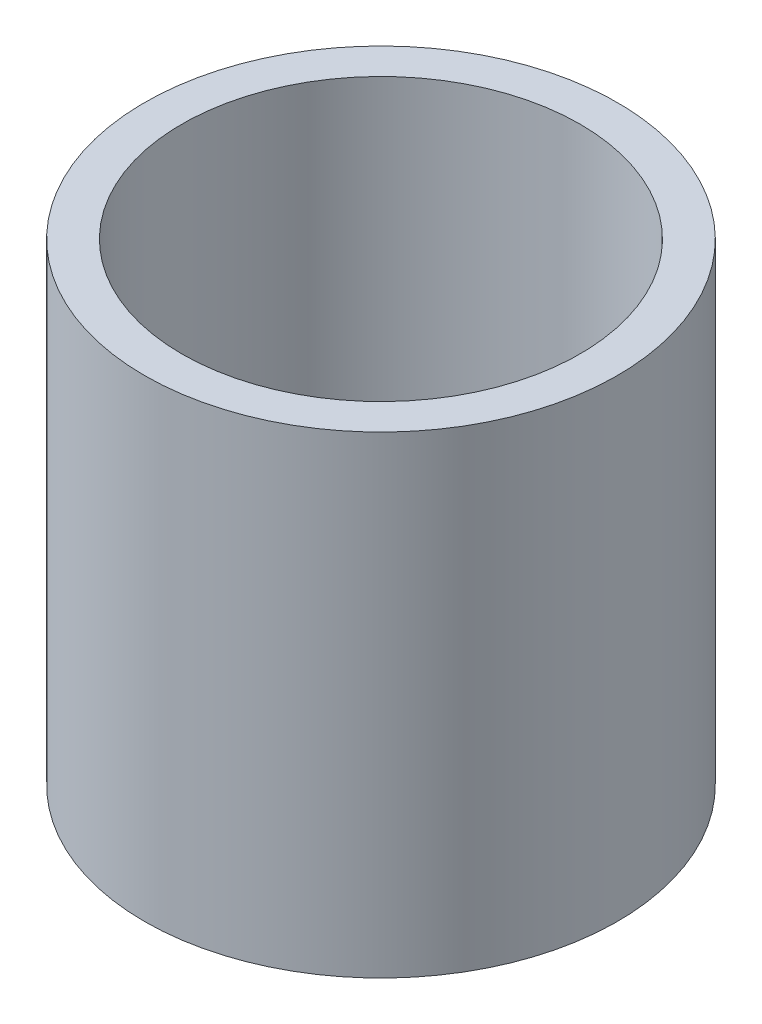
ISO-10303-21;
HEADER;
FILE_DESCRIPTION(('STEP AP214'),'2;1');
FILE_NAME('part.step','',(''),(''),'','','');
FILE_SCHEMA(('AUTOMOTIVE_DESIGN { 1 0 10303 214 1 1 1 1 }'));
ENDSEC;
DATA;
#1=APPLICATION_CONTEXT('core data for automotive mechanical design processes');
#2=APPLICATION_PROTOCOL_DEFINITION('international standard','automotive_design',2000,#1);
#3=PRODUCT_CONTEXT('',#1,'mechanical');
#4=PRODUCT('Part','Part','',(#3));
#5=PRODUCT_RELATED_PRODUCT_CATEGORY('part','',(#4));
#6=PRODUCT_DEFINITION_FORMATION('','',#4);
#7=PRODUCT_DEFINITION_CONTEXT('part definition',#1,'design');
#8=PRODUCT_DEFINITION('design','',#6,#7);
#9=PRODUCT_DEFINITION_SHAPE('','',#8);
#10=(LENGTH_UNIT() NAMED_UNIT(*) SI_UNIT(.MILLI.,.METRE.));
#11=(NAMED_UNIT(*) PLANE_ANGLE_UNIT() SI_UNIT($,.RADIAN.));
#12=(NAMED_UNIT(*) SI_UNIT($,.STERADIAN.) SOLID_ANGLE_UNIT());
#13=UNCERTAINTY_MEASURE_WITH_UNIT(LENGTH_MEASURE(1.E-05),#10,'distance_accuracy_value','');
#14=(GEOMETRIC_REPRESENTATION_CONTEXT(3) GLOBAL_UNCERTAINTY_ASSIGNED_CONTEXT((#13)) GLOBAL_UNIT_ASSIGNED_CONTEXT((#10,
#11,#12)) REPRESENTATION_CONTEXT('',''));
#15=CARTESIAN_POINT('',(0.,0.,0.));
#16=DIRECTION('',(0.,0.,1.));
#17=DIRECTION('',(1.,0.,0.));
#18=AXIS2_PLACEMENT_3D('',#15,#16,#17);
#19=CARTESIAN_POINT('',(0.,19.,0.));
#20=DIRECTION('',(0.,1.,0.));
#21=DIRECTION('',(0.,0.,1.));
#22=AXIS2_PLACEMENT_3D('',#19,#20,#21);
#23=PLANE('',#22);
#24=CARTESIAN_POINT('',(0.,19.,0.));
#25=DIRECTION('',(0.,1.,0.));
#26=DIRECTION('',(0.,0.,1.));
#27=AXIS2_PLACEMENT_3D('',#24,#25,#26);
#28=CIRCLE('',#27,9.5);
#29=CARTESIAN_POINT('',(0.,19.,9.5));
#30=VERTEX_POINT('',#29);
#31=EDGE_CURVE('E10',#30,#30,#28,.T.);
#32=ORIENTED_EDGE('',*,*,#31,.T.);
#33=EDGE_LOOP('',(#32));
#34=FACE_BOUND('',#33,.T.);
#35=CARTESIAN_POINT('',(0.,19.,0.));
#36=DIRECTION('',(0.,1.,0.));
#37=DIRECTION('',(0.,0.,1.));
#38=AXIS2_PLACEMENT_3D('',#35,#36,#37);
#39=CIRCLE('',#38,8.);
#40=CARTESIAN_POINT('',(0.,19.,8.));
#41=VERTEX_POINT('',#40);
#42=EDGE_CURVE('E56',#41,#41,#39,.T.);
#43=ORIENTED_EDGE('',*,*,#42,.F.);
#44=EDGE_LOOP('',(#43));
#45=FACE_BOUND('',#44,.T.);
#46=ADVANCED_FACE('F43',(#34,#45),#23,.T.);
#47=CARTESIAN_POINT('',(0.,0.,0.));
#48=DIRECTION('',(0.,1.,0.));
#49=DIRECTION('',(0.,0.,1.));
#50=AXIS2_PLACEMENT_3D('',#47,#48,#49);
#51=PLANE('',#50);
#52=CARTESIAN_POINT('',(0.,0.,0.));
#53=DIRECTION('',(0.,1.,0.));
#54=DIRECTION('',(0.,0.,1.));
#55=AXIS2_PLACEMENT_3D('',#52,#53,#54);
#56=CIRCLE('',#55,9.5);
#57=CARTESIAN_POINT('',(0.,0.,9.5));
#58=VERTEX_POINT('',#57);
#59=EDGE_CURVE('E47',#58,#58,#56,.T.);
#60=ORIENTED_EDGE('',*,*,#59,.F.);
#61=EDGE_LOOP('',(#60));
#62=FACE_BOUND('',#61,.T.);
#63=CARTESIAN_POINT('',(0.,0.,0.));
#64=DIRECTION('',(0.,1.,0.));
#65=DIRECTION('',(0.,0.,1.));
#66=AXIS2_PLACEMENT_3D('',#63,#64,#65);
#67=CIRCLE('',#66,8.);
#68=CARTESIAN_POINT('',(0.,0.,8.));
#69=VERTEX_POINT('',#68);
#70=EDGE_CURVE('E58',#69,#69,#67,.T.);
#71=ORIENTED_EDGE('',*,*,#70,.T.);
#72=EDGE_LOOP('',(#71));
#73=FACE_BOUND('',#72,.T.);
#74=ADVANCED_FACE('F70',(#62,#73),#51,.F.);
#75=CARTESIAN_POINT('',(0.,19.,0.));
#76=DIRECTION('',(0.,-1.,0.));
#77=DIRECTION('',(0.,0.,-1.));
#78=AXIS2_PLACEMENT_3D('',#75,#76,#77);
#79=CYLINDRICAL_SURFACE('',#78,9.5);
#80=ORIENTED_EDGE('',*,*,#31,.F.);
#81=EDGE_LOOP('',(#80));
#82=FACE_BOUND('',#81,.T.);
#83=ORIENTED_EDGE('',*,*,#59,.T.);
#84=EDGE_LOOP('',(#83));
#85=FACE_BOUND('',#84,.T.);
#86=ADVANCED_FACE('F45',(#82,#85),#79,.T.);
#87=CARTESIAN_POINT('',(0.,19.,0.));
#88=DIRECTION('',(0.,-1.,0.));
#89=DIRECTION('',(0.,0.,-1.));
#90=AXIS2_PLACEMENT_3D('',#87,#88,#89);
#91=CYLINDRICAL_SURFACE('',#90,8.);
#92=ORIENTED_EDGE('',*,*,#42,.T.);
#93=EDGE_LOOP('',(#92));
#94=FACE_BOUND('',#93,.T.);
#95=ORIENTED_EDGE('',*,*,#70,.F.);
#96=EDGE_LOOP('',(#95));
#97=FACE_BOUND('',#96,.T.);
#98=ADVANCED_FACE('F66',(#94,#97),#91,.F.);
#99=CLOSED_SHELL('',(#46,#74,#86,#98));
#100=MANIFOLD_SOLID_BREP('B2',#99);
#101=ADVANCED_BREP_SHAPE_REPRESENTATION('',(#18,#100),#14);
#102=SHAPE_DEFINITION_REPRESENTATION(#9,#101);
ENDSEC;
END-ISO-10303-21;
